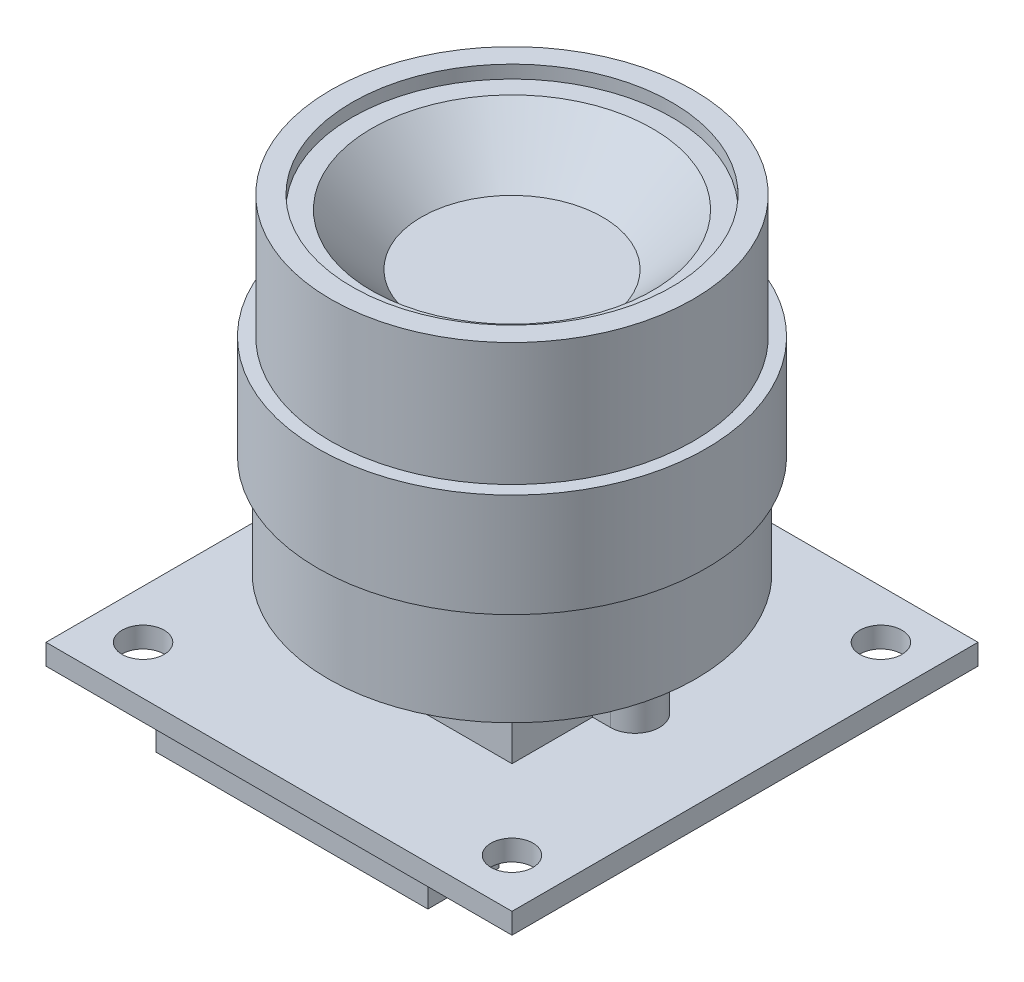
ISO-10303-21;
HEADER;
FILE_DESCRIPTION(('STEP AP214'),'2;1');
FILE_NAME('part.step','',(''),(''),'','','');
FILE_SCHEMA(('AUTOMOTIVE_DESIGN { 1 0 10303 214 1 1 1 1 }'));
ENDSEC;
DATA;
#1=APPLICATION_CONTEXT('core data for automotive mechanical design processes');
#2=APPLICATION_PROTOCOL_DEFINITION('international standard','automotive_design',2000,#1);
#3=PRODUCT_CONTEXT('',#1,'mechanical');
#4=PRODUCT('Part','Part','',(#3));
#5=PRODUCT_RELATED_PRODUCT_CATEGORY('part','',(#4));
#6=PRODUCT_DEFINITION_FORMATION('','',#4);
#7=PRODUCT_DEFINITION_CONTEXT('part definition',#1,'design');
#8=PRODUCT_DEFINITION('design','',#6,#7);
#9=PRODUCT_DEFINITION_SHAPE('','',#8);
#10=(LENGTH_UNIT() NAMED_UNIT(*) SI_UNIT(.MILLI.,.METRE.));
#11=(NAMED_UNIT(*) PLANE_ANGLE_UNIT() SI_UNIT($,.RADIAN.));
#12=(NAMED_UNIT(*) SI_UNIT($,.STERADIAN.) SOLID_ANGLE_UNIT());
#13=UNCERTAINTY_MEASURE_WITH_UNIT(LENGTH_MEASURE(1.E-05),#10,'distance_accuracy_value','');
#14=(GEOMETRIC_REPRESENTATION_CONTEXT(3) GLOBAL_UNCERTAINTY_ASSIGNED_CONTEXT((#13)) GLOBAL_UNIT_ASSIGNED_CONTEXT((#10,
#11,#12)) REPRESENTATION_CONTEXT('',''));
#15=CARTESIAN_POINT('',(0.,0.,0.));
#16=DIRECTION('',(0.,0.,1.));
#17=DIRECTION('',(1.,0.,0.));
#18=AXIS2_PLACEMENT_3D('',#15,#16,#17);
#19=CARTESIAN_POINT('',(0.,31.55,0.));
#20=DIRECTION('',(0.,1.,0.));
#21=DIRECTION('',(0.,0.,1.));
#22=AXIS2_PLACEMENT_3D('',#19,#20,#21);
#23=PLANE('',#22);
#24=CARTESIAN_POINT('',(0.,31.55,0.));
#25=DIRECTION('',(0.,1.,0.));
#26=DIRECTION('',(0.,0.,1.));
#27=AXIS2_PLACEMENT_3D('',#24,#25,#26);
#28=CIRCLE('',#27,14.);
#29=CARTESIAN_POINT('',(0.,31.55,14.));
#30=VERTEX_POINT('',#29);
#31=EDGE_CURVE('E202',#30,#30,#28,.T.);
#32=ORIENTED_EDGE('',*,*,#31,.T.);
#33=EDGE_LOOP('',(#32));
#34=FACE_BOUND('',#33,.T.);
#35=CARTESIAN_POINT('',(0.,31.55,0.));
#36=DIRECTION('',(0.,1.,0.));
#37=DIRECTION('',(-1.,0.,0.));
#38=AXIS2_PLACEMENT_3D('',#35,#36,#37);
#39=CIRCLE('',#38,12.35);
#40=CARTESIAN_POINT('',(-12.35,31.55,0.));
#41=VERTEX_POINT('',#40);
#42=EDGE_CURVE('E768',#41,#41,#39,.T.);
#43=ORIENTED_EDGE('',*,*,#42,.F.);
#44=EDGE_LOOP('',(#43));
#45=FACE_BOUND('',#44,.T.);
#46=ADVANCED_FACE('F37',(#34,#45),#23,.T.);
#47=CARTESIAN_POINT('',(0.,0.,0.));
#48=DIRECTION('',(0.,-1.,0.));
#49=DIRECTION('',(0.,0.,-1.));
#50=AXIS2_PLACEMENT_3D('',#47,#48,#49);
#51=PLANE('',#50);
#52=DIRECTION('',(0.,0.,-1.));
#53=VECTOR('',#52,1.);
#54=CARTESIAN_POINT('',(18.,0.,18.));
#55=LINE('',#54,#53);
#56=CARTESIAN_POINT('',(18.,0.,18.));
#57=VERTEX_POINT('',#56);
#58=CARTESIAN_POINT('',(18.,0.,-18.));
#59=VERTEX_POINT('',#58);
#60=EDGE_CURVE('E350',#57,#59,#55,.T.);
#61=ORIENTED_EDGE('',*,*,#60,.F.);
#62=DIRECTION('',(1.,0.,0.));
#63=VECTOR('',#62,1.);
#64=CARTESIAN_POINT('',(-18.,0.,18.));
#65=LINE('',#64,#63);
#66=CARTESIAN_POINT('',(-18.,0.,18.));
#67=VERTEX_POINT('',#66);
#68=EDGE_CURVE('E355',#67,#57,#65,.T.);
#69=ORIENTED_EDGE('',*,*,#68,.F.);
#70=DIRECTION('',(0.,0.,1.));
#71=VECTOR('',#70,1.);
#72=CARTESIAN_POINT('',(-18.,0.,18.));
#73=LINE('',#72,#71);
#74=CARTESIAN_POINT('',(-18.,0.,-18.));
#75=VERTEX_POINT('',#74);
#76=EDGE_CURVE('E366',#75,#67,#73,.T.);
#77=ORIENTED_EDGE('',*,*,#76,.F.);
#78=DIRECTION('',(-1.,0.,0.));
#79=VECTOR('',#78,1.);
#80=CARTESIAN_POINT('',(-18.,0.,-18.));
#81=LINE('',#80,#79);
#82=EDGE_CURVE('E364',#59,#75,#81,.T.);
#83=ORIENTED_EDGE('',*,*,#82,.F.);
#84=EDGE_LOOP('',(#61,#69,#77,#83));
#85=FACE_BOUND('',#84,.T.);
#86=CARTESIAN_POINT('',(-14.25,0.,14.25));
#87=DIRECTION('',(0.,1.,0.));
#88=DIRECTION('',(0.,0.,1.));
#89=AXIS2_PLACEMENT_3D('',#86,#87,#88);
#90=CIRCLE('',#89,1.62499999999999);
#91=CARTESIAN_POINT('',(-14.25,0.,15.875));
#92=VERTEX_POINT('',#91);
#93=EDGE_CURVE('E347',#92,#92,#90,.T.);
#94=ORIENTED_EDGE('',*,*,#93,.T.);
#95=EDGE_LOOP('',(#94));
#96=FACE_BOUND('',#95,.T.);
#97=CARTESIAN_POINT('',(14.25,0.,14.25));
#98=DIRECTION('',(0.,1.,0.));
#99=DIRECTION('',(0.,0.,1.));
#100=AXIS2_PLACEMENT_3D('',#97,#98,#99);
#101=CIRCLE('',#100,1.62499999999999);
#102=CARTESIAN_POINT('',(14.25,0.,15.875));
#103=VERTEX_POINT('',#102);
#104=EDGE_CURVE('E341',#103,#103,#101,.T.);
#105=ORIENTED_EDGE('',*,*,#104,.T.);
#106=EDGE_LOOP('',(#105));
#107=FACE_BOUND('',#106,.T.);
#108=CARTESIAN_POINT('',(14.25,0.,-14.25));
#109=DIRECTION('',(0.,1.,0.));
#110=DIRECTION('',(0.,0.,1.));
#111=AXIS2_PLACEMENT_3D('',#108,#109,#110);
#112=CIRCLE('',#111,1.62499999999999);
#113=CARTESIAN_POINT('',(14.25,0.,-12.625));
#114=VERTEX_POINT('',#113);
#115=EDGE_CURVE('E335',#114,#114,#112,.T.);
#116=ORIENTED_EDGE('',*,*,#115,.T.);
#117=EDGE_LOOP('',(#116));
#118=FACE_BOUND('',#117,.T.);
#119=CARTESIAN_POINT('',(-14.25,0.,-14.25));
#120=DIRECTION('',(0.,1.,0.));
#121=DIRECTION('',(0.,0.,1.));
#122=AXIS2_PLACEMENT_3D('',#119,#120,#121);
#123=CIRCLE('',#122,1.62499999999999);
#124=CARTESIAN_POINT('',(-14.25,0.,-12.625));
#125=VERTEX_POINT('',#124);
#126=EDGE_CURVE('E329',#125,#125,#123,.T.);
#127=ORIENTED_EDGE('',*,*,#126,.T.);
#128=EDGE_LOOP('',(#127));
#129=FACE_BOUND('',#128,.T.);
#130=DIRECTION('',(-1.,0.,0.));
#131=VECTOR('',#130,1.);
#132=CARTESIAN_POINT('',(-10.5,0.,17.));
#133=LINE('',#132,#131);
#134=CARTESIAN_POINT('',(10.5,0.,17.));
#135=VERTEX_POINT('',#134);
#136=CARTESIAN_POINT('',(-10.5,0.,17.));
#137=VERTEX_POINT('',#136);
#138=EDGE_CURVE('E775',#135,#137,#133,.T.);
#139=ORIENTED_EDGE('',*,*,#138,.F.);
#140=DIRECTION('',(0.,0.,1.));
#141=VECTOR('',#140,1.);
#142=CARTESIAN_POINT('',(10.5,0.,11.5));
#143=LINE('',#142,#141);
#144=CARTESIAN_POINT('',(10.5,0.,11.5));
#145=VERTEX_POINT('',#144);
#146=EDGE_CURVE('E197',#145,#135,#143,.T.);
#147=ORIENTED_EDGE('',*,*,#146,.F.);
#148=DIRECTION('',(1.,0.,0.));
#149=VECTOR('',#148,1.);
#150=CARTESIAN_POINT('',(-10.5,0.,11.5));
#151=LINE('',#150,#149);
#152=CARTESIAN_POINT('',(-10.5,0.,11.5));
#153=VERTEX_POINT('',#152);
#154=EDGE_CURVE('E193',#153,#145,#151,.T.);
#155=ORIENTED_EDGE('',*,*,#154,.F.);
#156=DIRECTION('',(0.,0.,-1.));
#157=VECTOR('',#156,1.);
#158=CARTESIAN_POINT('',(-10.5,0.,11.5));
#159=LINE('',#158,#157);
#160=EDGE_CURVE('E777',#137,#153,#159,.T.);
#161=ORIENTED_EDGE('',*,*,#160,.F.);
#162=EDGE_LOOP('',(#139,#147,#155,#161));
#163=FACE_BOUND('',#162,.T.);
#164=ADVANCED_FACE('F384',(#85,#96,#107,#118,#129,#163),#51,.T.);
#165=CARTESIAN_POINT('',(0.,22.05,0.));
#166=DIRECTION('',(0.,1.,0.));
#167=DIRECTION('',(0.,0.,1.));
#168=AXIS2_PLACEMENT_3D('',#165,#166,#167);
#169=PLANE('',#168);
#170=CARTESIAN_POINT('',(0.,22.05,0.));
#171=DIRECTION('',(0.,1.,0.));
#172=DIRECTION('',(0.,0.,1.));
#173=AXIS2_PLACEMENT_3D('',#170,#171,#172);
#174=CIRCLE('',#173,15.);
#175=CARTESIAN_POINT('',(0.,22.05,15.));
#176=VERTEX_POINT('',#175);
#177=EDGE_CURVE('E210',#176,#176,#174,.T.);
#178=ORIENTED_EDGE('',*,*,#177,.T.);
#179=EDGE_LOOP('',(#178));
#180=FACE_BOUND('',#179,.T.);
#181=CARTESIAN_POINT('',(0.,22.05,0.));
#182=DIRECTION('',(0.,1.,0.));
#183=DIRECTION('',(0.,0.,1.));
#184=AXIS2_PLACEMENT_3D('',#181,#182,#183);
#185=CIRCLE('',#184,14.);
#186=CARTESIAN_POINT('',(0.,22.05,14.));
#187=VERTEX_POINT('',#186);
#188=EDGE_CURVE('E199',#187,#187,#185,.T.);
#189=ORIENTED_EDGE('',*,*,#188,.F.);
#190=EDGE_LOOP('',(#189));
#191=FACE_BOUND('',#190,.T.);
#192=ADVANCED_FACE('F409',(#180,#191),#169,.T.);
#193=CARTESIAN_POINT('',(0.,1.6,0.));
#194=DIRECTION('',(0.,-1.,0.));
#195=DIRECTION('',(0.,0.,-1.));
#196=AXIS2_PLACEMENT_3D('',#193,#194,#195);
#197=PLANE('',#196);
#198=DIRECTION('',(0.,0.,-1.));
#199=VECTOR('',#198,1.);
#200=CARTESIAN_POINT('',(18.,1.6,18.));
#201=LINE('',#200,#199);
#202=CARTESIAN_POINT('',(18.,1.6,18.));
#203=VERTEX_POINT('',#202);
#204=CARTESIAN_POINT('',(18.,1.6,-18.));
#205=VERTEX_POINT('',#204);
#206=EDGE_CURVE('E351',#203,#205,#201,.T.);
#207=ORIENTED_EDGE('',*,*,#206,.T.);
#208=DIRECTION('',(-1.,0.,0.));
#209=VECTOR('',#208,1.);
#210=CARTESIAN_POINT('',(-18.,1.6,-18.));
#211=LINE('',#210,#209);
#212=CARTESIAN_POINT('',(-18.,1.6,-18.));
#213=VERTEX_POINT('',#212);
#214=EDGE_CURVE('E354',#205,#213,#211,.T.);
#215=ORIENTED_EDGE('',*,*,#214,.T.);
#216=DIRECTION('',(0.,0.,1.));
#217=VECTOR('',#216,1.);
#218=CARTESIAN_POINT('',(-18.,1.6,18.));
#219=LINE('',#218,#217);
#220=CARTESIAN_POINT('',(-18.,1.6,18.));
#221=VERTEX_POINT('',#220);
#222=EDGE_CURVE('E357',#213,#221,#219,.T.);
#223=ORIENTED_EDGE('',*,*,#222,.T.);
#224=DIRECTION('',(1.,0.,0.));
#225=VECTOR('',#224,1.);
#226=CARTESIAN_POINT('',(-18.,1.6,18.));
#227=LINE('',#226,#225);
#228=EDGE_CURVE('E359',#221,#203,#227,.T.);
#229=ORIENTED_EDGE('',*,*,#228,.T.);
#230=EDGE_LOOP('',(#207,#215,#223,#229));
#231=FACE_BOUND('',#230,.T.);
#232=CARTESIAN_POINT('',(-14.25,1.6,14.25));
#233=DIRECTION('',(0.,1.,0.));
#234=DIRECTION('',(0.,0.,1.));
#235=AXIS2_PLACEMENT_3D('',#232,#233,#234);
#236=CIRCLE('',#235,1.62499999999999);
#237=CARTESIAN_POINT('',(-14.25,1.6,15.875));
#238=VERTEX_POINT('',#237);
#239=EDGE_CURVE('E344',#238,#238,#236,.T.);
#240=ORIENTED_EDGE('',*,*,#239,.F.);
#241=EDGE_LOOP('',(#240));
#242=FACE_BOUND('',#241,.T.);
#243=CARTESIAN_POINT('',(14.25,1.6,14.25));
#244=DIRECTION('',(0.,1.,0.));
#245=DIRECTION('',(0.,0.,1.));
#246=AXIS2_PLACEMENT_3D('',#243,#244,#245);
#247=CIRCLE('',#246,1.62499999999999);
#248=CARTESIAN_POINT('',(14.25,1.6,15.875));
#249=VERTEX_POINT('',#248);
#250=EDGE_CURVE('E338',#249,#249,#247,.T.);
#251=ORIENTED_EDGE('',*,*,#250,.F.);
#252=EDGE_LOOP('',(#251));
#253=FACE_BOUND('',#252,.T.);
#254=CARTESIAN_POINT('',(14.25,1.6,-14.25));
#255=DIRECTION('',(0.,1.,0.));
#256=DIRECTION('',(0.,0.,1.));
#257=AXIS2_PLACEMENT_3D('',#254,#255,#256);
#258=CIRCLE('',#257,1.62499999999999);
#259=CARTESIAN_POINT('',(14.25,1.6,-12.625));
#260=VERTEX_POINT('',#259);
#261=EDGE_CURVE('E332',#260,#260,#258,.T.);
#262=ORIENTED_EDGE('',*,*,#261,.F.);
#263=EDGE_LOOP('',(#262));
#264=FACE_BOUND('',#263,.T.);
#265=CARTESIAN_POINT('',(-14.25,1.6,-14.25));
#266=DIRECTION('',(0.,1.,0.));
#267=DIRECTION('',(0.,0.,1.));
#268=AXIS2_PLACEMENT_3D('',#265,#266,#267);
#269=CIRCLE('',#268,1.62499999999999);
#270=CARTESIAN_POINT('',(-14.25,1.6,-12.625));
#271=VERTEX_POINT('',#270);
#272=EDGE_CURVE('E326',#271,#271,#269,.T.);
#273=ORIENTED_EDGE('',*,*,#272,.F.);
#274=EDGE_LOOP('',(#273));
#275=FACE_BOUND('',#274,.T.);
#276=DIRECTION('',(0.,0.,-1.));
#277=VECTOR('',#276,1.);
#278=CARTESIAN_POINT('',(8.125,1.6,-1.9));
#279=LINE('',#278,#277);
#280=CARTESIAN_POINT('',(8.125,1.6,-1.9));
#281=VERTEX_POINT('',#280);
#282=CARTESIAN_POINT('',(8.125,1.6,-8.125));
#283=VERTEX_POINT('',#282);
#284=EDGE_CURVE('E219',#281,#283,#279,.T.);
#285=ORIENTED_EDGE('',*,*,#284,.F.);
#286=DIRECTION('',(-1.,0.,0.));
#287=VECTOR('',#286,1.);
#288=CARTESIAN_POINT('',(8.125,1.6,-1.9));
#289=LINE('',#288,#287);
#290=CARTESIAN_POINT('',(9.5,1.6,-1.9));
#291=VERTEX_POINT('',#290);
#292=EDGE_CURVE('E226',#291,#281,#289,.T.);
#293=ORIENTED_EDGE('',*,*,#292,.F.);
#294=CARTESIAN_POINT('',(9.5,1.6,0.));
#295=DIRECTION('',(0.,1.,0.));
#296=DIRECTION('',(0.,0.,-1.));
#297=AXIS2_PLACEMENT_3D('',#294,#295,#296);
#298=CIRCLE('',#297,1.9);
#299=CARTESIAN_POINT('',(9.5,1.6,1.9));
#300=VERTEX_POINT('',#299);
#301=EDGE_CURVE('E287',#300,#291,#298,.T.);
#302=ORIENTED_EDGE('',*,*,#301,.F.);
#303=DIRECTION('',(1.,0.,0.));
#304=VECTOR('',#303,1.);
#305=CARTESIAN_POINT('',(8.125,1.6,1.9));
#306=LINE('',#305,#304);
#307=CARTESIAN_POINT('',(8.125,1.6,1.9));
#308=VERTEX_POINT('',#307);
#309=EDGE_CURVE('E284',#308,#300,#306,.T.);
#310=ORIENTED_EDGE('',*,*,#309,.F.);
#311=DIRECTION('',(0.,0.,-1.));
#312=VECTOR('',#311,1.);
#313=CARTESIAN_POINT('',(8.125,1.6,8.125));
#314=LINE('',#313,#312);
#315=CARTESIAN_POINT('',(8.125,1.6,8.125));
#316=VERTEX_POINT('',#315);
#317=EDGE_CURVE('E281',#316,#308,#314,.T.);
#318=ORIENTED_EDGE('',*,*,#317,.F.);
#319=DIRECTION('',(1.,0.,0.));
#320=VECTOR('',#319,1.);
#321=CARTESIAN_POINT('',(-8.125,1.6,8.125));
#322=LINE('',#321,#320);
#323=CARTESIAN_POINT('',(-8.125,1.6,8.125));
#324=VERTEX_POINT('',#323);
#325=EDGE_CURVE('E278',#324,#316,#322,.T.);
#326=ORIENTED_EDGE('',*,*,#325,.F.);
#327=DIRECTION('',(0.,0.,1.));
#328=VECTOR('',#327,1.);
#329=CARTESIAN_POINT('',(-8.125,1.6,8.125));
#330=LINE('',#329,#328);
#331=CARTESIAN_POINT('',(-8.125,1.6,1.9));
#332=VERTEX_POINT('',#331);
#333=EDGE_CURVE('E275',#332,#324,#330,.T.);
#334=ORIENTED_EDGE('',*,*,#333,.F.);
#335=DIRECTION('',(1.,0.,0.));
#336=VECTOR('',#335,1.);
#337=CARTESIAN_POINT('',(-9.5,1.6,1.9));
#338=LINE('',#337,#336);
#339=CARTESIAN_POINT('',(-9.5,1.6,1.9));
#340=VERTEX_POINT('',#339);
#341=EDGE_CURVE('E272',#340,#332,#338,.T.);
#342=ORIENTED_EDGE('',*,*,#341,.F.);
#343=CARTESIAN_POINT('',(-9.5,1.6,0.));
#344=DIRECTION('',(0.,1.,0.));
#345=DIRECTION('',(0.,0.,1.));
#346=AXIS2_PLACEMENT_3D('',#343,#344,#345);
#347=CIRCLE('',#346,1.9);
#348=CARTESIAN_POINT('',(-9.5,1.6,-1.9));
#349=VERTEX_POINT('',#348);
#350=EDGE_CURVE('E269',#349,#340,#347,.T.);
#351=ORIENTED_EDGE('',*,*,#350,.F.);
#352=DIRECTION('',(-1.,0.,0.));
#353=VECTOR('',#352,1.);
#354=CARTESIAN_POINT('',(-9.5,1.6,-1.9));
#355=LINE('',#354,#353);
#356=CARTESIAN_POINT('',(-8.125,1.6,-1.9));
#357=VERTEX_POINT('',#356);
#358=EDGE_CURVE('E266',#357,#349,#355,.T.);
#359=ORIENTED_EDGE('',*,*,#358,.F.);
#360=DIRECTION('',(0.,0.,1.));
#361=VECTOR('',#360,1.);
#362=CARTESIAN_POINT('',(-8.125,1.6,-1.9));
#363=LINE('',#362,#361);
#364=CARTESIAN_POINT('',(-8.125,1.6,-8.125));
#365=VERTEX_POINT('',#364);
#366=EDGE_CURVE('E263',#365,#357,#363,.T.);
#367=ORIENTED_EDGE('',*,*,#366,.F.);
#368=DIRECTION('',(-1.,0.,0.));
#369=VECTOR('',#368,1.);
#370=CARTESIAN_POINT('',(-8.125,1.6,-8.125));
#371=LINE('',#370,#369);
#372=EDGE_CURVE('E60',#283,#365,#371,.T.);
#373=ORIENTED_EDGE('',*,*,#372,.F.);
#374=EDGE_LOOP('',(#285,#293,#302,#310,#318,#326,#334,#342,#351,#359,#367,#373));
#375=FACE_BOUND('',#374,.T.);
#376=ADVANCED_FACE('F394',(#231,#242,#253,#264,#275,#375),#197,.F.);
#377=CARTESIAN_POINT('',(18.,1.6,18.));
#378=DIRECTION('',(-1.,0.,0.));
#379=DIRECTION('',(0.,0.,1.));
#380=AXIS2_PLACEMENT_3D('',#377,#378,#379);
#381=PLANE('',#380);
#382=ORIENTED_EDGE('',*,*,#60,.T.);
#383=DIRECTION('',(0.,-1.,0.));
#384=VECTOR('',#383,1.);
#385=CARTESIAN_POINT('',(18.,1.6,-18.));
#386=LINE('',#385,#384);
#387=EDGE_CURVE('E11',#205,#59,#386,.T.);
#388=ORIENTED_EDGE('',*,*,#387,.F.);
#389=ORIENTED_EDGE('',*,*,#206,.F.);
#390=DIRECTION('',(0.,-1.,0.));
#391=VECTOR('',#390,1.);
#392=CARTESIAN_POINT('',(18.,1.6,18.));
#393=LINE('',#392,#391);
#394=EDGE_CURVE('E361',#203,#57,#393,.T.);
#395=ORIENTED_EDGE('',*,*,#394,.T.);
#396=EDGE_LOOP('',(#382,#388,#389,#395));
#397=FACE_BOUND('',#396,.T.);
#398=ADVANCED_FACE('F39',(#397),#381,.F.);
#399=CARTESIAN_POINT('',(-18.,1.6,-18.));
#400=DIRECTION('',(0.,0.,1.));
#401=DIRECTION('',(1.,0.,0.));
#402=AXIS2_PLACEMENT_3D('',#399,#400,#401);
#403=PLANE('',#402);
#404=ORIENTED_EDGE('',*,*,#82,.T.);
#405=DIRECTION('',(0.,-1.,0.));
#406=VECTOR('',#405,1.);
#407=CARTESIAN_POINT('',(-18.,1.6,-18.));
#408=LINE('',#407,#406);
#409=EDGE_CURVE('E45',#213,#75,#408,.T.);
#410=ORIENTED_EDGE('',*,*,#409,.F.);
#411=ORIENTED_EDGE('',*,*,#214,.F.);
#412=ORIENTED_EDGE('',*,*,#387,.T.);
#413=EDGE_LOOP('',(#404,#410,#411,#412));
#414=FACE_BOUND('',#413,.T.);
#415=ADVANCED_FACE('F396',(#414),#403,.F.);
#416=CARTESIAN_POINT('',(-18.,1.6,18.));
#417=DIRECTION('',(1.,0.,0.));
#418=DIRECTION('',(0.,0.,-1.));
#419=AXIS2_PLACEMENT_3D('',#416,#417,#418);
#420=PLANE('',#419);
#421=ORIENTED_EDGE('',*,*,#76,.T.);
#422=DIRECTION('',(0.,-1.,0.));
#423=VECTOR('',#422,1.);
#424=CARTESIAN_POINT('',(-18.,1.6,18.));
#425=LINE('',#424,#423);
#426=EDGE_CURVE('E371',#221,#67,#425,.T.);
#427=ORIENTED_EDGE('',*,*,#426,.F.);
#428=ORIENTED_EDGE('',*,*,#222,.F.);
#429=ORIENTED_EDGE('',*,*,#409,.T.);
#430=EDGE_LOOP('',(#421,#427,#428,#429));
#431=FACE_BOUND('',#430,.T.);
#432=ADVANCED_FACE('F378',(#431),#420,.F.);
#433=CARTESIAN_POINT('',(-18.,1.6,18.));
#434=DIRECTION('',(0.,0.,-1.));
#435=DIRECTION('',(-1.,0.,0.));
#436=AXIS2_PLACEMENT_3D('',#433,#434,#435);
#437=PLANE('',#436);
#438=ORIENTED_EDGE('',*,*,#68,.T.);
#439=ORIENTED_EDGE('',*,*,#394,.F.);
#440=ORIENTED_EDGE('',*,*,#228,.F.);
#441=ORIENTED_EDGE('',*,*,#426,.T.);
#442=EDGE_LOOP('',(#438,#439,#440,#441));
#443=FACE_BOUND('',#442,.T.);
#444=ADVANCED_FACE('F388',(#443),#437,.F.);
#445=CARTESIAN_POINT('',(-14.25,1.6,14.25));
#446=DIRECTION('',(0.,1.,0.));
#447=DIRECTION('',(0.,0.,1.));
#448=AXIS2_PLACEMENT_3D('',#445,#446,#447);
#449=CYLINDRICAL_SURFACE('',#448,1.62499999999999);
#450=ORIENTED_EDGE('',*,*,#93,.F.);
#451=EDGE_LOOP('',(#450));
#452=FACE_BOUND('',#451,.T.);
#453=ORIENTED_EDGE('',*,*,#239,.T.);
#454=EDGE_LOOP('',(#453));
#455=FACE_BOUND('',#454,.T.);
#456=ADVANCED_FACE('F497',(#452,#455),#449,.F.);
#457=CARTESIAN_POINT('',(14.25,1.6,14.25));
#458=DIRECTION('',(0.,1.,0.));
#459=DIRECTION('',(0.,0.,1.));
#460=AXIS2_PLACEMENT_3D('',#457,#458,#459);
#461=CYLINDRICAL_SURFACE('',#460,1.62499999999999);
#462=ORIENTED_EDGE('',*,*,#104,.F.);
#463=EDGE_LOOP('',(#462));
#464=FACE_BOUND('',#463,.T.);
#465=ORIENTED_EDGE('',*,*,#250,.T.);
#466=EDGE_LOOP('',(#465));
#467=FACE_BOUND('',#466,.T.);
#468=ADVANCED_FACE('F493',(#464,#467),#461,.F.);
#469=CARTESIAN_POINT('',(14.25,1.6,-14.25));
#470=DIRECTION('',(0.,1.,0.));
#471=DIRECTION('',(0.,0.,1.));
#472=AXIS2_PLACEMENT_3D('',#469,#470,#471);
#473=CYLINDRICAL_SURFACE('',#472,1.62499999999999);
#474=ORIENTED_EDGE('',*,*,#115,.F.);
#475=EDGE_LOOP('',(#474));
#476=FACE_BOUND('',#475,.T.);
#477=ORIENTED_EDGE('',*,*,#261,.T.);
#478=EDGE_LOOP('',(#477));
#479=FACE_BOUND('',#478,.T.);
#480=ADVANCED_FACE('F489',(#476,#479),#473,.F.);
#481=CARTESIAN_POINT('',(-14.25,1.6,-14.25));
#482=DIRECTION('',(0.,1.,0.));
#483=DIRECTION('',(0.,0.,1.));
#484=AXIS2_PLACEMENT_3D('',#481,#482,#483);
#485=CYLINDRICAL_SURFACE('',#484,1.62499999999999);
#486=ORIENTED_EDGE('',*,*,#126,.F.);
#487=EDGE_LOOP('',(#486));
#488=FACE_BOUND('',#487,.T.);
#489=ORIENTED_EDGE('',*,*,#272,.T.);
#490=EDGE_LOOP('',(#489));
#491=FACE_BOUND('',#490,.T.);
#492=ADVANCED_FACE('F485',(#488,#491),#485,.F.);
#493=CARTESIAN_POINT('',(8.125,6.25,-1.9));
#494=DIRECTION('',(-1.,0.,0.));
#495=DIRECTION('',(0.,0.,1.));
#496=AXIS2_PLACEMENT_3D('',#493,#494,#495);
#497=PLANE('',#496);
#498=ORIENTED_EDGE('',*,*,#284,.T.);
#499=DIRECTION('',(0.,-1.,0.));
#500=VECTOR('',#499,1.);
#501=CARTESIAN_POINT('',(8.125,6.25,-8.125));
#502=LINE('',#501,#500);
#503=CARTESIAN_POINT('',(8.125,6.25,-8.125));
#504=VERTEX_POINT('',#503);
#505=EDGE_CURVE('E324',#504,#283,#502,.T.);
#506=ORIENTED_EDGE('',*,*,#505,.F.);
#507=DIRECTION('',(0.,0.,-1.));
#508=VECTOR('',#507,1.);
#509=CARTESIAN_POINT('',(8.125,6.25,-1.9));
#510=LINE('',#509,#508);
#511=CARTESIAN_POINT('',(8.125,6.25,-1.9));
#512=VERTEX_POINT('',#511);
#513=EDGE_CURVE('E222',#512,#504,#510,.T.);
#514=ORIENTED_EDGE('',*,*,#513,.F.);
#515=DIRECTION('',(0.,-1.,0.));
#516=VECTOR('',#515,1.);
#517=CARTESIAN_POINT('',(8.125,6.25,-1.9));
#518=LINE('',#517,#516);
#519=EDGE_CURVE('E259',#512,#281,#518,.T.);
#520=ORIENTED_EDGE('',*,*,#519,.T.);
#521=EDGE_LOOP('',(#498,#506,#514,#520));
#522=FACE_BOUND('',#521,.T.);
#523=ADVANCED_FACE('F481',(#522),#497,.F.);
#524=CARTESIAN_POINT('',(-8.125,6.25,-8.125));
#525=DIRECTION('',(0.,0.,1.));
#526=DIRECTION('',(1.,0.,0.));
#527=AXIS2_PLACEMENT_3D('',#524,#525,#526);
#528=PLANE('',#527);
#529=ORIENTED_EDGE('',*,*,#372,.T.);
#530=DIRECTION('',(0.,-1.,0.));
#531=VECTOR('',#530,1.);
#532=CARTESIAN_POINT('',(-8.125,6.25,-8.125));
#533=LINE('',#532,#531);
#534=CARTESIAN_POINT('',(-8.125,6.25,-8.125));
#535=VERTEX_POINT('',#534);
#536=EDGE_CURVE('E321',#535,#365,#533,.T.);
#537=ORIENTED_EDGE('',*,*,#536,.F.);
#538=DIRECTION('',(-1.,0.,0.));
#539=VECTOR('',#538,1.);
#540=CARTESIAN_POINT('',(-8.125,6.25,-8.125));
#541=LINE('',#540,#539);
#542=EDGE_CURVE('E225',#504,#535,#541,.T.);
#543=ORIENTED_EDGE('',*,*,#542,.F.);
#544=ORIENTED_EDGE('',*,*,#505,.T.);
#545=EDGE_LOOP('',(#529,#537,#543,#544));
#546=FACE_BOUND('',#545,.T.);
#547=ADVANCED_FACE('F477',(#546),#528,.F.);
#548=CARTESIAN_POINT('',(-8.125,6.25,-1.9));
#549=DIRECTION('',(1.,0.,0.));
#550=DIRECTION('',(0.,0.,-1.));
#551=AXIS2_PLACEMENT_3D('',#548,#549,#550);
#552=PLANE('',#551);
#553=ORIENTED_EDGE('',*,*,#366,.T.);
#554=DIRECTION('',(0.,-1.,0.));
#555=VECTOR('',#554,1.);
#556=CARTESIAN_POINT('',(-8.125,6.25,-1.9));
#557=LINE('',#556,#555);
#558=CARTESIAN_POINT('',(-8.125,6.25,-1.9));
#559=VERTEX_POINT('',#558);
#560=EDGE_CURVE('E318',#559,#357,#557,.T.);
#561=ORIENTED_EDGE('',*,*,#560,.F.);
#562=DIRECTION('',(0.,0.,1.));
#563=VECTOR('',#562,1.);
#564=CARTESIAN_POINT('',(-8.125,6.25,-1.9));
#565=LINE('',#564,#563);
#566=EDGE_CURVE('E229',#535,#559,#565,.T.);
#567=ORIENTED_EDGE('',*,*,#566,.F.);
#568=ORIENTED_EDGE('',*,*,#536,.T.);
#569=EDGE_LOOP('',(#553,#561,#567,#568));
#570=FACE_BOUND('',#569,.T.);
#571=ADVANCED_FACE('F473',(#570),#552,.F.);
#572=CARTESIAN_POINT('',(-9.5,6.25,-1.9));
#573=DIRECTION('',(0.,0.,1.));
#574=DIRECTION('',(1.,0.,0.));
#575=AXIS2_PLACEMENT_3D('',#572,#573,#574);
#576=PLANE('',#575);
#577=ORIENTED_EDGE('',*,*,#358,.T.);
#578=DIRECTION('',(0.,-1.,0.));
#579=VECTOR('',#578,1.);
#580=CARTESIAN_POINT('',(-9.5,6.25,-1.9));
#581=LINE('',#580,#579);
#582=CARTESIAN_POINT('',(-9.5,6.25,-1.9));
#583=VERTEX_POINT('',#582);
#584=EDGE_CURVE('E315',#583,#349,#581,.T.);
#585=ORIENTED_EDGE('',*,*,#584,.F.);
#586=DIRECTION('',(-1.,0.,0.));
#587=VECTOR('',#586,1.);
#588=CARTESIAN_POINT('',(-9.5,6.25,-1.9));
#589=LINE('',#588,#587);
#590=EDGE_CURVE('E232',#559,#583,#589,.T.);
#591=ORIENTED_EDGE('',*,*,#590,.F.);
#592=ORIENTED_EDGE('',*,*,#560,.T.);
#593=EDGE_LOOP('',(#577,#585,#591,#592));
#594=FACE_BOUND('',#593,.T.);
#595=ADVANCED_FACE('F469',(#594),#576,.F.);
#596=CARTESIAN_POINT('',(-9.5,6.25,0.));
#597=DIRECTION('',(0.,-1.,0.));
#598=DIRECTION('',(0.,0.,-1.));
#599=AXIS2_PLACEMENT_3D('',#596,#597,#598);
#600=CYLINDRICAL_SURFACE('',#599,1.9);
#601=ORIENTED_EDGE('',*,*,#350,.T.);
#602=DIRECTION('',(0.,-1.,0.));
#603=VECTOR('',#602,1.);
#604=CARTESIAN_POINT('',(-9.5,6.25,1.9));
#605=LINE('',#604,#603);
#606=CARTESIAN_POINT('',(-9.5,6.25,1.9));
#607=VERTEX_POINT('',#606);
#608=EDGE_CURVE('E312',#607,#340,#605,.T.);
#609=ORIENTED_EDGE('',*,*,#608,.F.);
#610=CARTESIAN_POINT('',(-9.5,6.25,0.));
#611=DIRECTION('',(0.,1.,0.));
#612=DIRECTION('',(0.,0.,1.));
#613=AXIS2_PLACEMENT_3D('',#610,#611,#612);
#614=CIRCLE('',#613,1.9);
#615=EDGE_CURVE('E235',#583,#607,#614,.T.);
#616=ORIENTED_EDGE('',*,*,#615,.F.);
#617=ORIENTED_EDGE('',*,*,#584,.T.);
#618=EDGE_LOOP('',(#601,#609,#616,#617));
#619=FACE_BOUND('',#618,.T.);
#620=ADVANCED_FACE('F465',(#619),#600,.T.);
#621=CARTESIAN_POINT('',(-9.5,6.25,1.9));
#622=DIRECTION('',(0.,0.,-1.));
#623=DIRECTION('',(-1.,0.,0.));
#624=AXIS2_PLACEMENT_3D('',#621,#622,#623);
#625=PLANE('',#624);
#626=ORIENTED_EDGE('',*,*,#341,.T.);
#627=DIRECTION('',(0.,-1.,0.));
#628=VECTOR('',#627,1.);
#629=CARTESIAN_POINT('',(-8.125,6.25,1.9));
#630=LINE('',#629,#628);
#631=CARTESIAN_POINT('',(-8.125,6.25,1.9));
#632=VERTEX_POINT('',#631);
#633=EDGE_CURVE('E309',#632,#332,#630,.T.);
#634=ORIENTED_EDGE('',*,*,#633,.F.);
#635=DIRECTION('',(1.,0.,0.));
#636=VECTOR('',#635,1.);
#637=CARTESIAN_POINT('',(-9.5,6.25,1.9));
#638=LINE('',#637,#636);
#639=EDGE_CURVE('E238',#607,#632,#638,.T.);
#640=ORIENTED_EDGE('',*,*,#639,.F.);
#641=ORIENTED_EDGE('',*,*,#608,.T.);
#642=EDGE_LOOP('',(#626,#634,#640,#641));
#643=FACE_BOUND('',#642,.T.);
#644=ADVANCED_FACE('F461',(#643),#625,.F.);
#645=CARTESIAN_POINT('',(-8.125,6.25,8.125));
#646=DIRECTION('',(1.,0.,0.));
#647=DIRECTION('',(0.,0.,-1.));
#648=AXIS2_PLACEMENT_3D('',#645,#646,#647);
#649=PLANE('',#648);
#650=ORIENTED_EDGE('',*,*,#333,.T.);
#651=DIRECTION('',(0.,-1.,0.));
#652=VECTOR('',#651,1.);
#653=CARTESIAN_POINT('',(-8.125,6.25,8.125));
#654=LINE('',#653,#652);
#655=CARTESIAN_POINT('',(-8.125,6.25,8.125));
#656=VERTEX_POINT('',#655);
#657=EDGE_CURVE('E306',#656,#324,#654,.T.);
#658=ORIENTED_EDGE('',*,*,#657,.F.);
#659=DIRECTION('',(0.,0.,1.));
#660=VECTOR('',#659,1.);
#661=CARTESIAN_POINT('',(-8.125,6.25,8.125));
#662=LINE('',#661,#660);
#663=EDGE_CURVE('E241',#632,#656,#662,.T.);
#664=ORIENTED_EDGE('',*,*,#663,.F.);
#665=ORIENTED_EDGE('',*,*,#633,.T.);
#666=EDGE_LOOP('',(#650,#658,#664,#665));
#667=FACE_BOUND('',#666,.T.);
#668=ADVANCED_FACE('F457',(#667),#649,.F.);
#669=CARTESIAN_POINT('',(-8.125,6.25,8.125));
#670=DIRECTION('',(0.,0.,-1.));
#671=DIRECTION('',(-1.,0.,0.));
#672=AXIS2_PLACEMENT_3D('',#669,#670,#671);
#673=PLANE('',#672);
#674=ORIENTED_EDGE('',*,*,#325,.T.);
#675=DIRECTION('',(0.,-1.,0.));
#676=VECTOR('',#675,1.);
#677=CARTESIAN_POINT('',(8.125,6.25,8.125));
#678=LINE('',#677,#676);
#679=CARTESIAN_POINT('',(8.125,6.25,8.125));
#680=VERTEX_POINT('',#679);
#681=EDGE_CURVE('E303',#680,#316,#678,.T.);
#682=ORIENTED_EDGE('',*,*,#681,.F.);
#683=DIRECTION('',(1.,0.,0.));
#684=VECTOR('',#683,1.);
#685=CARTESIAN_POINT('',(-8.125,6.25,8.125));
#686=LINE('',#685,#684);
#687=EDGE_CURVE('E244',#656,#680,#686,.T.);
#688=ORIENTED_EDGE('',*,*,#687,.F.);
#689=ORIENTED_EDGE('',*,*,#657,.T.);
#690=EDGE_LOOP('',(#674,#682,#688,#689));
#691=FACE_BOUND('',#690,.T.);
#692=ADVANCED_FACE('F453',(#691),#673,.F.);
#693=CARTESIAN_POINT('',(8.125,6.25,8.125));
#694=DIRECTION('',(-1.,0.,0.));
#695=DIRECTION('',(0.,0.,1.));
#696=AXIS2_PLACEMENT_3D('',#693,#694,#695);
#697=PLANE('',#696);
#698=ORIENTED_EDGE('',*,*,#317,.T.);
#699=DIRECTION('',(0.,-1.,0.));
#700=VECTOR('',#699,1.);
#701=CARTESIAN_POINT('',(8.125,6.25,1.9));
#702=LINE('',#701,#700);
#703=CARTESIAN_POINT('',(8.125,6.25,1.9));
#704=VERTEX_POINT('',#703);
#705=EDGE_CURVE('E300',#704,#308,#702,.T.);
#706=ORIENTED_EDGE('',*,*,#705,.F.);
#707=DIRECTION('',(0.,0.,-1.));
#708=VECTOR('',#707,1.);
#709=CARTESIAN_POINT('',(8.125,6.25,8.125));
#710=LINE('',#709,#708);
#711=EDGE_CURVE('E247',#680,#704,#710,.T.);
#712=ORIENTED_EDGE('',*,*,#711,.F.);
#713=ORIENTED_EDGE('',*,*,#681,.T.);
#714=EDGE_LOOP('',(#698,#706,#712,#713));
#715=FACE_BOUND('',#714,.T.);
#716=ADVANCED_FACE('F449',(#715),#697,.F.);
#717=CARTESIAN_POINT('',(8.125,6.25,1.9));
#718=DIRECTION('',(0.,0.,-1.));
#719=DIRECTION('',(-1.,0.,0.));
#720=AXIS2_PLACEMENT_3D('',#717,#718,#719);
#721=PLANE('',#720);
#722=ORIENTED_EDGE('',*,*,#309,.T.);
#723=DIRECTION('',(0.,-1.,0.));
#724=VECTOR('',#723,1.);
#725=CARTESIAN_POINT('',(9.5,6.25,1.9));
#726=LINE('',#725,#724);
#727=CARTESIAN_POINT('',(9.5,6.25,1.9));
#728=VERTEX_POINT('',#727);
#729=EDGE_CURVE('E297',#728,#300,#726,.T.);
#730=ORIENTED_EDGE('',*,*,#729,.F.);
#731=DIRECTION('',(1.,0.,0.));
#732=VECTOR('',#731,1.);
#733=CARTESIAN_POINT('',(8.125,6.25,1.9));
#734=LINE('',#733,#732);
#735=EDGE_CURVE('E250',#704,#728,#734,.T.);
#736=ORIENTED_EDGE('',*,*,#735,.F.);
#737=ORIENTED_EDGE('',*,*,#705,.T.);
#738=EDGE_LOOP('',(#722,#730,#736,#737));
#739=FACE_BOUND('',#738,.T.);
#740=ADVANCED_FACE('F445',(#739),#721,.F.);
#741=CARTESIAN_POINT('',(9.5,6.25,0.));
#742=DIRECTION('',(0.,-1.,0.));
#743=DIRECTION('',(0.,0.,-1.));
#744=AXIS2_PLACEMENT_3D('',#741,#742,#743);
#745=CYLINDRICAL_SURFACE('',#744,1.9);
#746=ORIENTED_EDGE('',*,*,#301,.T.);
#747=DIRECTION('',(0.,-1.,0.));
#748=VECTOR('',#747,1.);
#749=CARTESIAN_POINT('',(9.5,6.25,-1.9));
#750=LINE('',#749,#748);
#751=CARTESIAN_POINT('',(9.5,6.25,-1.9));
#752=VERTEX_POINT('',#751);
#753=EDGE_CURVE('E294',#752,#291,#750,.T.);
#754=ORIENTED_EDGE('',*,*,#753,.F.);
#755=CARTESIAN_POINT('',(9.5,6.25,0.));
#756=DIRECTION('',(0.,1.,0.));
#757=DIRECTION('',(0.,0.,-1.));
#758=AXIS2_PLACEMENT_3D('',#755,#756,#757);
#759=CIRCLE('',#758,1.9);
#760=EDGE_CURVE('E253',#728,#752,#759,.T.);
#761=ORIENTED_EDGE('',*,*,#760,.F.);
#762=ORIENTED_EDGE('',*,*,#729,.T.);
#763=EDGE_LOOP('',(#746,#754,#761,#762));
#764=FACE_BOUND('',#763,.T.);
#765=ADVANCED_FACE('F441',(#764),#745,.T.);
#766=CARTESIAN_POINT('',(8.125,6.25,-1.9));
#767=DIRECTION('',(0.,0.,1.));
#768=DIRECTION('',(1.,0.,0.));
#769=AXIS2_PLACEMENT_3D('',#766,#767,#768);
#770=PLANE('',#769);
#771=ORIENTED_EDGE('',*,*,#292,.T.);
#772=ORIENTED_EDGE('',*,*,#519,.F.);
#773=DIRECTION('',(-1.,0.,0.));
#774=VECTOR('',#773,1.);
#775=CARTESIAN_POINT('',(8.125,6.25,-1.9));
#776=LINE('',#775,#774);
#777=EDGE_CURVE('E256',#752,#512,#776,.T.);
#778=ORIENTED_EDGE('',*,*,#777,.F.);
#779=ORIENTED_EDGE('',*,*,#753,.T.);
#780=EDGE_LOOP('',(#771,#772,#778,#779));
#781=FACE_BOUND('',#780,.T.);
#782=ADVANCED_FACE('F434',(#781),#770,.F.);
#783=CARTESIAN_POINT('',(0.,6.25,0.));
#784=DIRECTION('',(0.,1.,0.));
#785=DIRECTION('',(0.,0.,1.));
#786=AXIS2_PLACEMENT_3D('',#783,#784,#785);
#787=PLANE('',#786);
#788=CARTESIAN_POINT('',(0.,6.25,0.));
#789=DIRECTION('',(0.,1.,0.));
#790=DIRECTION('',(0.,0.,1.));
#791=AXIS2_PLACEMENT_3D('',#788,#789,#790);
#792=CIRCLE('',#791,14.2);
#793=CARTESIAN_POINT('',(0.,6.25,14.2));
#794=VERTEX_POINT('',#793);
#795=EDGE_CURVE('E213',#794,#794,#792,.T.);
#796=ORIENTED_EDGE('',*,*,#795,.F.);
#797=EDGE_LOOP('',(#796));
#798=FACE_BOUND('',#797,.T.);
#799=ORIENTED_EDGE('',*,*,#777,.T.);
#800=ORIENTED_EDGE('',*,*,#513,.T.);
#801=ORIENTED_EDGE('',*,*,#542,.T.);
#802=ORIENTED_EDGE('',*,*,#566,.T.);
#803=ORIENTED_EDGE('',*,*,#590,.T.);
#804=ORIENTED_EDGE('',*,*,#615,.T.);
#805=ORIENTED_EDGE('',*,*,#639,.T.);
#806=ORIENTED_EDGE('',*,*,#663,.T.);
#807=ORIENTED_EDGE('',*,*,#687,.T.);
#808=ORIENTED_EDGE('',*,*,#711,.T.);
#809=ORIENTED_EDGE('',*,*,#735,.T.);
#810=ORIENTED_EDGE('',*,*,#760,.T.);
#811=EDGE_LOOP('',(#799,#800,#801,#802,#803,#804,#805,#806,#807,#808,#809,#810));
#812=FACE_BOUND('',#811,.T.);
#813=ADVANCED_FACE('F431',(#798,#812),#787,.F.);
#814=CARTESIAN_POINT('',(0.,14.05,0.));
#815=DIRECTION('',(0.,-1.,0.));
#816=DIRECTION('',(0.,0.,-1.));
#817=AXIS2_PLACEMENT_3D('',#814,#815,#816);
#818=CYLINDRICAL_SURFACE('',#817,14.2);
#819=CARTESIAN_POINT('',(0.,14.05,0.));
#820=DIRECTION('',(0.,1.,0.));
#821=DIRECTION('',(0.,0.,1.));
#822=AXIS2_PLACEMENT_3D('',#819,#820,#821);
#823=CIRCLE('',#822,14.2);
#824=CARTESIAN_POINT('',(0.,14.05,14.2));
#825=VERTEX_POINT('',#824);
#826=EDGE_CURVE('E216',#825,#825,#823,.T.);
#827=ORIENTED_EDGE('',*,*,#826,.F.);
#828=EDGE_LOOP('',(#827));
#829=FACE_BOUND('',#828,.T.);
#830=ORIENTED_EDGE('',*,*,#795,.T.);
#831=EDGE_LOOP('',(#830));
#832=FACE_BOUND('',#831,.T.);
#833=ADVANCED_FACE('F426',(#829,#832),#818,.T.);
#834=CARTESIAN_POINT('',(0.,14.05,0.));
#835=DIRECTION('',(0.,1.,0.));
#836=DIRECTION('',(0.,0.,1.));
#837=AXIS2_PLACEMENT_3D('',#834,#835,#836);
#838=PLANE('',#837);
#839=CARTESIAN_POINT('',(0.,14.05,0.));
#840=DIRECTION('',(0.,1.,0.));
#841=DIRECTION('',(0.,0.,1.));
#842=AXIS2_PLACEMENT_3D('',#839,#840,#841);
#843=CIRCLE('',#842,15.);
#844=CARTESIAN_POINT('',(0.,14.05,15.));
#845=VERTEX_POINT('',#844);
#846=EDGE_CURVE('E208',#845,#845,#843,.T.);
#847=ORIENTED_EDGE('',*,*,#846,.F.);
#848=EDGE_LOOP('',(#847));
#849=FACE_BOUND('',#848,.T.);
#850=ORIENTED_EDGE('',*,*,#826,.T.);
#851=EDGE_LOOP('',(#850));
#852=FACE_BOUND('',#851,.T.);
#853=ADVANCED_FACE('F423',(#849,#852),#838,.F.);
#854=CARTESIAN_POINT('',(0.,22.05,0.));
#855=DIRECTION('',(0.,-1.,0.));
#856=DIRECTION('',(0.,0.,-1.));
#857=AXIS2_PLACEMENT_3D('',#854,#855,#856);
#858=CYLINDRICAL_SURFACE('',#857,15.);
#859=ORIENTED_EDGE('',*,*,#177,.F.);
#860=EDGE_LOOP('',(#859));
#861=FACE_BOUND('',#860,.T.);
#862=ORIENTED_EDGE('',*,*,#846,.T.);
#863=EDGE_LOOP('',(#862));
#864=FACE_BOUND('',#863,.T.);
#865=ADVANCED_FACE('F418',(#861,#864),#858,.T.);
#866=CARTESIAN_POINT('',(0.,31.55,0.));
#867=DIRECTION('',(0.,-1.,0.));
#868=DIRECTION('',(0.,0.,-1.));
#869=AXIS2_PLACEMENT_3D('',#866,#867,#868);
#870=CYLINDRICAL_SURFACE('',#869,14.);
#871=ORIENTED_EDGE('',*,*,#31,.F.);
#872=EDGE_LOOP('',(#871));
#873=FACE_BOUND('',#872,.T.);
#874=ORIENTED_EDGE('',*,*,#188,.T.);
#875=EDGE_LOOP('',(#874));
#876=FACE_BOUND('',#875,.T.);
#877=ADVANCED_FACE('F415',(#873,#876),#870,.T.);
#878=CARTESIAN_POINT('',(10.5,-2.5,11.5));
#879=DIRECTION('',(-1.,0.,0.));
#880=DIRECTION('',(0.,0.,1.));
#881=AXIS2_PLACEMENT_3D('',#878,#879,#880);
#882=PLANE('',#881);
#883=ORIENTED_EDGE('',*,*,#146,.T.);
#884=DIRECTION('',(0.,1.,0.));
#885=VECTOR('',#884,1.);
#886=CARTESIAN_POINT('',(10.5,-2.5,17.));
#887=LINE('',#886,#885);
#888=CARTESIAN_POINT('',(10.5,-2.5,17.));
#889=VERTEX_POINT('',#888);
#890=EDGE_CURVE('E178',#889,#135,#887,.T.);
#891=ORIENTED_EDGE('',*,*,#890,.F.);
#892=DIRECTION('',(0.,0.,1.));
#893=VECTOR('',#892,1.);
#894=CARTESIAN_POINT('',(10.5,-2.5,11.5));
#895=LINE('',#894,#893);
#896=CARTESIAN_POINT('',(10.5,-2.5,11.5));
#897=VERTEX_POINT('',#896);
#898=EDGE_CURVE('E185',#897,#889,#895,.T.);
#899=ORIENTED_EDGE('',*,*,#898,.F.);
#900=DIRECTION('',(0.,1.,0.));
#901=VECTOR('',#900,1.);
#902=CARTESIAN_POINT('',(10.5,-2.5,11.5));
#903=LINE('',#902,#901);
#904=EDGE_CURVE('E773',#897,#145,#903,.T.);
#905=ORIENTED_EDGE('',*,*,#904,.T.);
#906=EDGE_LOOP('',(#883,#891,#899,#905));
#907=FACE_BOUND('',#906,.T.);
#908=ADVANCED_FACE('F195',(#907),#882,.F.);
#909=CARTESIAN_POINT('',(-10.5,-2.5,17.));
#910=DIRECTION('',(0.,0.,-1.));
#911=DIRECTION('',(-1.,0.,0.));
#912=AXIS2_PLACEMENT_3D('',#909,#910,#911);
#913=PLANE('',#912);
#914=ORIENTED_EDGE('',*,*,#138,.T.);
#915=DIRECTION('',(0.,1.,0.));
#916=VECTOR('',#915,1.);
#917=CARTESIAN_POINT('',(-10.5,-2.5,17.));
#918=LINE('',#917,#916);
#919=CARTESIAN_POINT('',(-10.5,-2.5,17.));
#920=VERTEX_POINT('',#919);
#921=EDGE_CURVE('E181',#920,#137,#918,.T.);
#922=ORIENTED_EDGE('',*,*,#921,.F.);
#923=DIRECTION('',(-1.,0.,0.));
#924=VECTOR('',#923,1.);
#925=CARTESIAN_POINT('',(-10.5,-2.5,17.));
#926=LINE('',#925,#924);
#927=EDGE_CURVE('E174',#889,#920,#926,.T.);
#928=ORIENTED_EDGE('',*,*,#927,.F.);
#929=ORIENTED_EDGE('',*,*,#890,.T.);
#930=EDGE_LOOP('',(#914,#922,#928,#929));
#931=FACE_BOUND('',#930,.T.);
#932=ADVANCED_FACE('F176',(#931),#913,.F.);
#933=CARTESIAN_POINT('',(-10.5,-2.5,11.5));
#934=DIRECTION('',(1.,0.,0.));
#935=DIRECTION('',(0.,0.,-1.));
#936=AXIS2_PLACEMENT_3D('',#933,#934,#935);
#937=PLANE('',#936);
#938=ORIENTED_EDGE('',*,*,#160,.T.);
#939=DIRECTION('',(0.,1.,0.));
#940=VECTOR('',#939,1.);
#941=CARTESIAN_POINT('',(-10.5,-2.5,11.5));
#942=LINE('',#941,#940);
#943=CARTESIAN_POINT('',(-10.5,-2.5,11.5));
#944=VERTEX_POINT('',#943);
#945=EDGE_CURVE('E52',#944,#153,#942,.T.);
#946=ORIENTED_EDGE('',*,*,#945,.F.);
#947=DIRECTION('',(0.,0.,-1.));
#948=VECTOR('',#947,1.);
#949=CARTESIAN_POINT('',(-10.5,-2.5,11.5));
#950=LINE('',#949,#948);
#951=EDGE_CURVE('E184',#920,#944,#950,.T.);
#952=ORIENTED_EDGE('',*,*,#951,.F.);
#953=ORIENTED_EDGE('',*,*,#921,.T.);
#954=EDGE_LOOP('',(#938,#946,#952,#953));
#955=FACE_BOUND('',#954,.T.);
#956=ADVANCED_FACE('F607',(#955),#937,.F.);
#957=CARTESIAN_POINT('',(-10.5,-2.5,11.5));
#958=DIRECTION('',(0.,0.,1.));
#959=DIRECTION('',(1.,0.,0.));
#960=AXIS2_PLACEMENT_3D('',#957,#958,#959);
#961=PLANE('',#960);
#962=ORIENTED_EDGE('',*,*,#154,.T.);
#963=ORIENTED_EDGE('',*,*,#904,.F.);
#964=DIRECTION('',(1.,0.,0.));
#965=VECTOR('',#964,1.);
#966=CARTESIAN_POINT('',(-10.5,-2.5,11.5));
#967=LINE('',#966,#965);
#968=EDGE_CURVE('E189',#944,#897,#967,.T.);
#969=ORIENTED_EDGE('',*,*,#968,.F.);
#970=ORIENTED_EDGE('',*,*,#945,.T.);
#971=EDGE_LOOP('',(#962,#963,#969,#970));
#972=FACE_BOUND('',#971,.T.);
#973=ADVANCED_FACE('F613',(#972),#961,.F.);
#974=CARTESIAN_POINT('',(0.,-2.5,0.));
#975=DIRECTION('',(0.,1.,0.));
#976=DIRECTION('',(0.,0.,1.));
#977=AXIS2_PLACEMENT_3D('',#974,#975,#976);
#978=PLANE('',#977);
#979=ORIENTED_EDGE('',*,*,#898,.T.);
#980=ORIENTED_EDGE('',*,*,#927,.T.);
#981=ORIENTED_EDGE('',*,*,#951,.T.);
#982=ORIENTED_EDGE('',*,*,#968,.T.);
#983=EDGE_LOOP('',(#979,#980,#981,#982));
#984=FACE_BOUND('',#983,.T.);
#985=ADVANCED_FACE('F188',(#984),#978,.F.);
#986=CARTESIAN_POINT('',(0.,31.55,0.));
#987=DIRECTION('',(0.,1.,0.));
#988=DIRECTION('',(-1.,0.,0.));
#989=AXIS2_PLACEMENT_3D('',#986,#987,#988);
#990=CYLINDRICAL_SURFACE('',#989,12.35);
#991=ORIENTED_EDGE('',*,*,#42,.T.);
#992=EDGE_LOOP('',(#991));
#993=FACE_BOUND('',#992,.T.);
#994=CARTESIAN_POINT('',(0.,30.55,0.));
#995=DIRECTION('',(0.,1.,0.));
#996=DIRECTION('',(-1.,0.,0.));
#997=AXIS2_PLACEMENT_3D('',#994,#995,#996);
#998=CIRCLE('',#997,12.35);
#999=CARTESIAN_POINT('',(-12.35,30.55,0.));
#1000=VERTEX_POINT('',#999);
#1001=EDGE_CURVE('E763',#1000,#1000,#998,.T.);
#1002=ORIENTED_EDGE('',*,*,#1001,.F.);
#1003=EDGE_LOOP('',(#1002));
#1004=FACE_BOUND('',#1003,.T.);
#1005=ADVANCED_FACE('F627',(#993,#1004),#990,.F.);
#1006=CARTESIAN_POINT('',(12.35,30.55,0.));
#1007=DIRECTION('',(0.,1.,0.));
#1008=DIRECTION('',(-1.,0.,0.));
#1009=AXIS2_PLACEMENT_3D('',#1006,#1007,#1008);
#1010=PLANE('',#1009);
#1011=ORIENTED_EDGE('',*,*,#1001,.T.);
#1012=EDGE_LOOP('',(#1011));
#1013=FACE_BOUND('',#1012,.T.);
#1014=CARTESIAN_POINT('',(0.,30.55,0.));
#1015=DIRECTION('',(0.,1.,0.));
#1016=DIRECTION('',(-1.,0.,0.));
#1017=AXIS2_PLACEMENT_3D('',#1014,#1015,#1016);
#1018=CIRCLE('',#1017,10.85);
#1019=CARTESIAN_POINT('',(-10.85,30.55,0.));
#1020=VERTEX_POINT('',#1019);
#1021=EDGE_CURVE('E760',#1020,#1020,#1018,.T.);
#1022=ORIENTED_EDGE('',*,*,#1021,.F.);
#1023=EDGE_LOOP('',(#1022));
#1024=FACE_BOUND('',#1023,.T.);
#1025=ADVANCED_FACE('F634',(#1013,#1024),#1010,.T.);
#1026=CARTESIAN_POINT('',(0.,26.55,0.));
#1027=DIRECTION('',(0.,1.,0.));
#1028=DIRECTION('',(-1.,0.,0.));
#1029=AXIS2_PLACEMENT_3D('',#1026,#1027,#1028);
#1030=CONICAL_SURFACE('',#1029,7.,0.766292208279007);
#1031=ORIENTED_EDGE('',*,*,#1021,.T.);
#1032=EDGE_LOOP('',(#1031));
#1033=FACE_BOUND('',#1032,.T.);
#1034=CARTESIAN_POINT('',(0.,26.55,0.));
#1035=DIRECTION('',(0.,1.,0.));
#1036=DIRECTION('',(-1.,0.,0.));
#1037=AXIS2_PLACEMENT_3D('',#1034,#1035,#1036);
#1038=CIRCLE('',#1037,7.);
#1039=CARTESIAN_POINT('',(-7.,26.55,0.));
#1040=VERTEX_POINT('',#1039);
#1041=EDGE_CURVE('E758',#1040,#1040,#1038,.T.);
#1042=ORIENTED_EDGE('',*,*,#1041,.F.);
#1043=EDGE_LOOP('',(#1042));
#1044=FACE_BOUND('',#1043,.T.);
#1045=ADVANCED_FACE('F642',(#1033,#1044),#1030,.F.);
#1046=CARTESIAN_POINT('',(7.,26.55,0.));
#1047=DIRECTION('',(0.,1.,0.));
#1048=DIRECTION('',(-1.,0.,0.));
#1049=AXIS2_PLACEMENT_3D('',#1046,#1047,#1048);
#1050=PLANE('',#1049);
#1051=ORIENTED_EDGE('',*,*,#1041,.T.);
#1052=EDGE_LOOP('',(#1051));
#1053=FACE_BOUND('',#1052,.T.);
#1054=ADVANCED_FACE('F650',(#1053),#1050,.T.);
#1055=CLOSED_SHELL('',(#46,#164,#192,#376,#398,#415,#432,#444,#456,#468,#480,#492,#523,#547,
#571,#595,#620,#644,#668,#692,#716,#740,#765,#782,#813,#833,#853,#865,#877,#908,#932,#956,#973,
#985,#1005,#1025,#1045,#1054));
#1056=MANIFOLD_SOLID_BREP('B2',#1055);
#1057=ADVANCED_BREP_SHAPE_REPRESENTATION('',(#18,#1056),#14);
#1058=SHAPE_DEFINITION_REPRESENTATION(#9,#1057);
ENDSEC;
END-ISO-10303-21;
